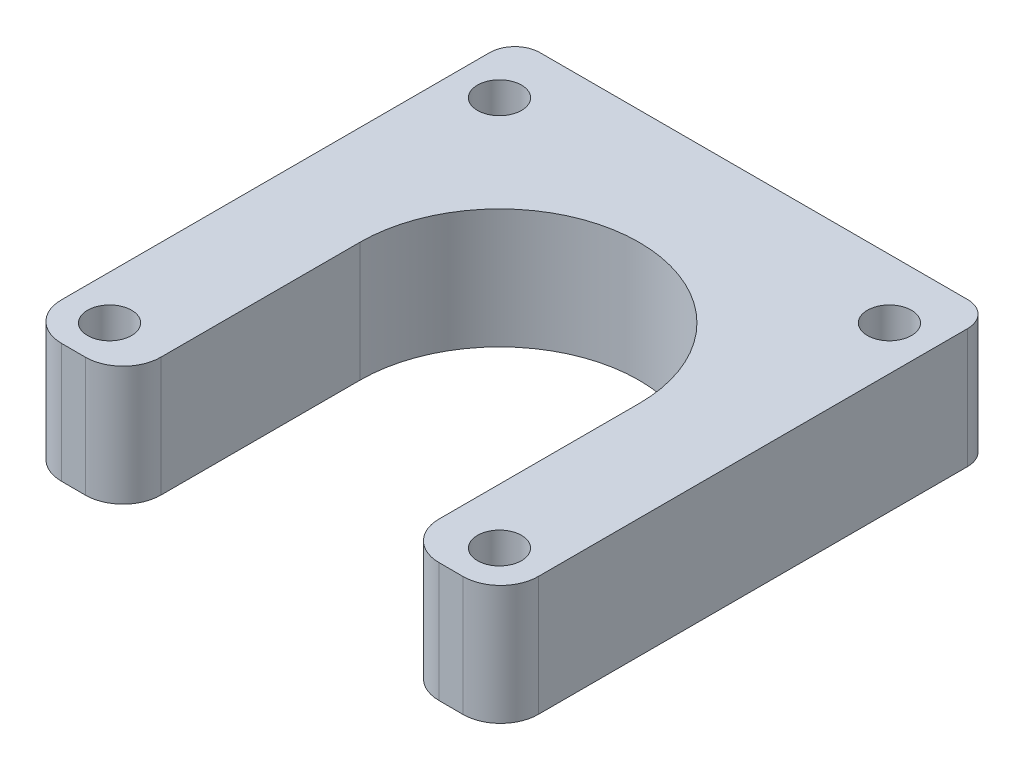
ISO-10303-21;
HEADER;
FILE_DESCRIPTION(('STEP AP214'),'2;1');
FILE_NAME('part.step','',(''),(''),'','','');
FILE_SCHEMA(('AUTOMOTIVE_DESIGN { 1 0 10303 214 1 1 1 1 }'));
ENDSEC;
DATA;
#1=APPLICATION_CONTEXT('core data for automotive mechanical design processes');
#2=APPLICATION_PROTOCOL_DEFINITION('international standard','automotive_design',2000,#1);
#3=PRODUCT_CONTEXT('',#1,'mechanical');
#4=PRODUCT('Part','Part','',(#3));
#5=PRODUCT_RELATED_PRODUCT_CATEGORY('part','',(#4));
#6=PRODUCT_DEFINITION_FORMATION('','',#4);
#7=PRODUCT_DEFINITION_CONTEXT('part definition',#1,'design');
#8=PRODUCT_DEFINITION('design','',#6,#7);
#9=PRODUCT_DEFINITION_SHAPE('','',#8);
#10=(LENGTH_UNIT() NAMED_UNIT(*) SI_UNIT(.MILLI.,.METRE.));
#11=(NAMED_UNIT(*) PLANE_ANGLE_UNIT() SI_UNIT($,.RADIAN.));
#12=(NAMED_UNIT(*) SI_UNIT($,.STERADIAN.) SOLID_ANGLE_UNIT());
#13=UNCERTAINTY_MEASURE_WITH_UNIT(LENGTH_MEASURE(1.E-05),#10,'distance_accuracy_value','');
#14=(GEOMETRIC_REPRESENTATION_CONTEXT(3) GLOBAL_UNCERTAINTY_ASSIGNED_CONTEXT((#13)) GLOBAL_UNIT_ASSIGNED_CONTEXT((#10,
#11,#12)) REPRESENTATION_CONTEXT('',''));
#15=CARTESIAN_POINT('',(0.,0.,0.));
#16=DIRECTION('',(0.,0.,1.));
#17=DIRECTION('',(1.,0.,0.));
#18=AXIS2_PLACEMENT_3D('',#15,#16,#17);
#19=CARTESIAN_POINT('',(13.4999920055001,9.5,10.6274478684913));
#20=DIRECTION('',(0.,1.,0.));
#21=DIRECTION('',(0.,0.,1.));
#22=AXIS2_PLACEMENT_3D('',#19,#20,#21);
#23=PLANE('',#22);
#24=CARTESIAN_POINT('',(13.0000039955001,9.5,10.216258));
#25=DIRECTION('',(0.,1.,0.));
#26=DIRECTION('',(0.,0.,1.));
#27=AXIS2_PLACEMENT_3D('',#24,#25,#26);
#28=CIRCLE('',#27,1.75);
#29=CARTESIAN_POINT('',(13.0000039955001,9.5,11.966258));
#30=VERTEX_POINT('',#29);
#31=EDGE_CURVE('E317',#30,#30,#28,.T.);
#32=ORIENTED_EDGE('',*,*,#31,.F.);
#33=EDGE_LOOP('',(#32));
#34=FACE_BOUND('',#33,.T.);
#35=CARTESIAN_POINT('',(-17.9999960045,9.5,10.216258));
#36=DIRECTION('',(0.,1.,0.));
#37=DIRECTION('',(0.,0.,1.));
#38=AXIS2_PLACEMENT_3D('',#35,#36,#37);
#39=CIRCLE('',#38,1.75);
#40=CARTESIAN_POINT('',(-17.9999960045,9.5,11.966258));
#41=VERTEX_POINT('',#40);
#42=EDGE_CURVE('E170',#41,#41,#39,.T.);
#43=ORIENTED_EDGE('',*,*,#42,.F.);
#44=EDGE_LOOP('',(#43));
#45=FACE_BOUND('',#44,.T.);
#46=CARTESIAN_POINT('',(13.4999920055001,9.5,10.6274478684913));
#47=DIRECTION('',(0.,1.,0.));
#48=DIRECTION('',(0.,0.,1.));
#49=AXIS2_PLACEMENT_3D('',#46,#47,#48);
#50=CIRCLE('',#49,3.);
#51=CARTESIAN_POINT('',(13.4911512782193,9.5,13.6274348420532));
#52=VERTEX_POINT('',#51);
#53=CARTESIAN_POINT('',(16.4999920055001,9.5,10.6274478684913));
#54=VERTEX_POINT('',#53);
#55=EDGE_CURVE('E193',#52,#54,#50,.T.);
#56=ORIENTED_EDGE('',*,*,#55,.T.);
#57=DIRECTION('',(0.,0.,-1.));
#58=VECTOR('',#57,1.);
#59=CARTESIAN_POINT('',(16.4999920055001,9.5,9.99405524209995));
#60=LINE('',#59,#58);
#61=CARTESIAN_POINT('',(16.4999925005001,9.5,-23.500009));
#62=VERTEX_POINT('',#61);
#63=EDGE_CURVE('E111',#54,#62,#60,.T.);
#64=ORIENTED_EDGE('',*,*,#63,.T.);
#65=CARTESIAN_POINT('',(14.4999900255,9.5,-23.500009));
#66=DIRECTION('',(0.,1.,0.));
#67=DIRECTION('',(0.,0.,1.));
#68=AXIS2_PLACEMENT_3D('',#65,#66,#67);
#69=CIRCLE('',#68,2.00000247500008);
#70=CARTESIAN_POINT('',(14.4999900255,9.5,-25.5000109800001));
#71=VERTEX_POINT('',#70);
#72=EDGE_CURVE('E226',#62,#71,#69,.T.);
#73=ORIENTED_EDGE('',*,*,#72,.T.);
#74=DIRECTION('',(-1.,0.,0.));
#75=VECTOR('',#74,1.);
#76=CARTESIAN_POINT('',(14.4999900255,9.5,-25.5000109800001));
#77=LINE('',#76,#75);
#78=CARTESIAN_POINT('',(-19.4999939745,9.5,-25.5000109800001));
#79=VERTEX_POINT('',#78);
#80=EDGE_CURVE('E245',#71,#79,#77,.T.);
#81=ORIENTED_EDGE('',*,*,#80,.T.);
#82=CARTESIAN_POINT('',(-19.4999910045007,9.5,-23.5000109800021));
#83=DIRECTION('',(0.,1.,0.));
#84=DIRECTION('',(0.,0.,1.));
#85=AXIS2_PLACEMENT_3D('',#82,#83,#84);
#86=CIRCLE('',#85,2.00000000000012);
#87=CARTESIAN_POINT('',(-21.4999910044999,9.5,-23.5000090698));
#88=VERTEX_POINT('',#87);
#89=EDGE_CURVE('E242',#79,#88,#86,.T.);
#90=ORIENTED_EDGE('',*,*,#89,.T.);
#91=DIRECTION('',(-2.67661864643519E-08,0.,1.));
#92=VECTOR('',#91,1.);
#93=CARTESIAN_POINT('',(-21.4999910044999,9.5,-23.5000090698));
#94=LINE('',#93,#92);
#95=CARTESIAN_POINT('',(-21.4999919154377,9.5,10.5331463351113));
#96=VERTEX_POINT('',#95);
#97=EDGE_CURVE('E244',#88,#96,#94,.T.);
#98=ORIENTED_EDGE('',*,*,#97,.T.);
#99=CARTESIAN_POINT('',(-18.4999919154377,9.5,10.5331464154099));
#100=DIRECTION('',(0.,1.,0.));
#101=DIRECTION('',(0.,0.,-1.));
#102=AXIS2_PLACEMENT_3D('',#99,#100,#101);
#103=CIRCLE('',#102,3.);
#104=CARTESIAN_POINT('',(-18.5088326427184,9.5,13.5331333889718));
#105=VERTEX_POINT('',#104);
#106=EDGE_CURVE('E247',#96,#105,#103,.T.);
#107=ORIENTED_EDGE('',*,*,#106,.T.);
#108=DIRECTION('',(0.99999565785397,0.,0.00294690909357009));
#109=VECTOR('',#108,1.);
#110=CARTESIAN_POINT('',(-18.5088326427184,9.5,13.5331333889718));
#111=LINE('',#110,#109);
#112=CARTESIAN_POINT('',(-16.6088367317806,9.5,13.5387325285118));
#113=VERTEX_POINT('',#112);
#114=EDGE_CURVE('E253',#105,#113,#111,.T.);
#115=ORIENTED_EDGE('',*,*,#114,.T.);
#116=CARTESIAN_POINT('',(-16.5999960044998,9.5,10.5387455549499));
#117=DIRECTION('',(0.,1.,0.));
#118=DIRECTION('',(0.,0.,1.));
#119=AXIS2_PLACEMENT_3D('',#116,#117,#118);
#120=CIRCLE('',#119,3.);
#121=CARTESIAN_POINT('',(-13.5999960044998,9.5,10.5387455549499));
#122=VERTEX_POINT('',#121);
#123=EDGE_CURVE('E255',#113,#122,#120,.T.);
#124=ORIENTED_EDGE('',*,*,#123,.T.);
#125=DIRECTION('',(0.,0.,-1.));
#126=VECTOR('',#125,1.);
#127=CARTESIAN_POINT('',(-13.5999960044998,9.5,-5.28374200000004));
#128=LINE('',#127,#126);
#129=CARTESIAN_POINT('',(-13.5999960044998,9.5,-5.28374200000004));
#130=VERTEX_POINT('',#129);
#131=EDGE_CURVE('E257',#122,#130,#128,.T.);
#132=ORIENTED_EDGE('',*,*,#131,.T.);
#133=CARTESIAN_POINT('',(-2.49999600449996,9.5,-5.28374200000004));
#134=DIRECTION('',(0.,-1.,0.));
#135=DIRECTION('',(0.,0.,1.));
#136=AXIS2_PLACEMENT_3D('',#133,#134,#135);
#137=CIRCLE('',#136,11.0999999999999);
#138=CARTESIAN_POINT('',(8.60000399549993,9.5,-5.28374200000004));
#139=VERTEX_POINT('',#138);
#140=EDGE_CURVE('E148',#130,#139,#137,.T.);
#141=ORIENTED_EDGE('',*,*,#140,.T.);
#142=DIRECTION('',(0.,0.,1.));
#143=VECTOR('',#142,1.);
#144=CARTESIAN_POINT('',(8.60000399549993,9.5,-5.28374200000004));
#145=LINE('',#144,#143);
#146=CARTESIAN_POINT('',(8.60000399549993,9.5,10.6218487522347));
#147=VERTEX_POINT('',#146);
#148=EDGE_CURVE('E142',#139,#147,#145,.T.);
#149=ORIENTED_EDGE('',*,*,#148,.T.);
#150=CARTESIAN_POINT('',(11.6000039954999,9.5,10.6218487522348));
#151=DIRECTION('',(0.,1.,0.));
#152=DIRECTION('',(0.,0.,-1.));
#153=AXIS2_PLACEMENT_3D('',#150,#151,#152);
#154=CIRCLE('',#153,3.);
#155=CARTESIAN_POINT('',(11.5911632682192,9.5,13.6218357257967));
#156=VERTEX_POINT('',#155);
#157=EDGE_CURVE('E146',#147,#156,#154,.T.);
#158=ORIENTED_EDGE('',*,*,#157,.T.);
#159=DIRECTION('',(0.99999565785397,0.,0.00294690909357004));
#160=VECTOR('',#159,1.);
#161=CARTESIAN_POINT('',(11.5911632682192,9.5,13.6218357257967));
#162=LINE('',#161,#160);
#163=EDGE_CURVE('E50',#156,#52,#162,.T.);
#164=ORIENTED_EDGE('',*,*,#163,.T.);
#165=EDGE_LOOP('',(#56,#64,#73,#81,#90,#98,#107,#115,#124,#132,#141,#149,#158,#164));
#166=FACE_BOUND('',#165,.T.);
#167=CARTESIAN_POINT('',(-17.9999960045,9.5,-20.783742));
#168=DIRECTION('',(0.,1.,0.));
#169=DIRECTION('',(0.,0.,1.));
#170=AXIS2_PLACEMENT_3D('',#167,#168,#169);
#171=CIRCLE('',#170,1.75);
#172=CARTESIAN_POINT('',(-17.9999960045,9.5,-19.033742));
#173=VERTEX_POINT('',#172);
#174=EDGE_CURVE('E323',#173,#173,#171,.T.);
#175=ORIENTED_EDGE('',*,*,#174,.F.);
#176=EDGE_LOOP('',(#175));
#177=FACE_BOUND('',#176,.T.);
#178=CARTESIAN_POINT('',(13.0000039955001,9.5,-20.783742));
#179=DIRECTION('',(0.,1.,0.));
#180=DIRECTION('',(0.,0.,1.));
#181=AXIS2_PLACEMENT_3D('',#178,#179,#180);
#182=CIRCLE('',#181,1.75);
#183=CARTESIAN_POINT('',(13.0000039955001,9.5,-19.033742));
#184=VERTEX_POINT('',#183);
#185=EDGE_CURVE('E308',#184,#184,#182,.T.);
#186=ORIENTED_EDGE('',*,*,#185,.F.);
#187=EDGE_LOOP('',(#186));
#188=FACE_BOUND('',#187,.T.);
#189=ADVANCED_FACE('F33',(#34,#45,#166,#177,#188),#23,.T.);
#190=CARTESIAN_POINT('',(13.4999920055001,0.,10.6274478684913));
#191=DIRECTION('',(0.,1.,0.));
#192=DIRECTION('',(0.,0.,1.));
#193=AXIS2_PLACEMENT_3D('',#190,#191,#192);
#194=PLANE('',#193);
#195=CARTESIAN_POINT('',(13.4999920055001,0.,10.6274478684913));
#196=DIRECTION('',(0.,1.,0.));
#197=DIRECTION('',(0.,0.,1.));
#198=AXIS2_PLACEMENT_3D('',#195,#196,#197);
#199=CIRCLE('',#198,3.);
#200=CARTESIAN_POINT('',(13.4911512782193,0.,13.6274348420532));
#201=VERTEX_POINT('',#200);
#202=CARTESIAN_POINT('',(16.4999920055001,0.,10.6274478684913));
#203=VERTEX_POINT('',#202);
#204=EDGE_CURVE('E166',#201,#203,#199,.T.);
#205=ORIENTED_EDGE('',*,*,#204,.F.);
#206=DIRECTION('',(0.99999565785397,0.,0.00294690909357004));
#207=VECTOR('',#206,1.);
#208=CARTESIAN_POINT('',(11.5911632682192,0.,13.6218357257967));
#209=LINE('',#208,#207);
#210=CARTESIAN_POINT('',(11.5911632682192,0.,13.6218357257967));
#211=VERTEX_POINT('',#210);
#212=EDGE_CURVE('E103',#211,#201,#209,.T.);
#213=ORIENTED_EDGE('',*,*,#212,.F.);
#214=CARTESIAN_POINT('',(11.6000039954999,0.,10.6218487522348));
#215=DIRECTION('',(0.,1.,0.));
#216=DIRECTION('',(0.,0.,-1.));
#217=AXIS2_PLACEMENT_3D('',#214,#215,#216);
#218=CIRCLE('',#217,3.);
#219=CARTESIAN_POINT('',(8.60000399549993,0.,10.6218487522347));
#220=VERTEX_POINT('',#219);
#221=EDGE_CURVE('E97',#220,#211,#218,.T.);
#222=ORIENTED_EDGE('',*,*,#221,.F.);
#223=DIRECTION('',(0.,0.,1.));
#224=VECTOR('',#223,1.);
#225=CARTESIAN_POINT('',(8.60000399549993,0.,-5.28374200000004));
#226=LINE('',#225,#224);
#227=CARTESIAN_POINT('',(8.60000399549993,0.,-5.28374200000004));
#228=VERTEX_POINT('',#227);
#229=EDGE_CURVE('E156',#228,#220,#226,.T.);
#230=ORIENTED_EDGE('',*,*,#229,.F.);
#231=CARTESIAN_POINT('',(-2.49999600449996,0.,-5.28374200000004));
#232=DIRECTION('',(0.,-1.,0.));
#233=DIRECTION('',(0.,0.,1.));
#234=AXIS2_PLACEMENT_3D('',#231,#232,#233);
#235=CIRCLE('',#234,11.0999999999999);
#236=CARTESIAN_POINT('',(-13.5999960044998,0.,-5.28374200000004));
#237=VERTEX_POINT('',#236);
#238=EDGE_CURVE('E188',#237,#228,#235,.T.);
#239=ORIENTED_EDGE('',*,*,#238,.F.);
#240=DIRECTION('',(0.,0.,-1.));
#241=VECTOR('',#240,1.);
#242=CARTESIAN_POINT('',(-13.5999960044998,0.,-5.28374200000004));
#243=LINE('',#242,#241);
#244=CARTESIAN_POINT('',(-13.5999960044998,0.,10.5387455549499));
#245=VERTEX_POINT('',#244);
#246=EDGE_CURVE('E186',#245,#237,#243,.T.);
#247=ORIENTED_EDGE('',*,*,#246,.F.);
#248=CARTESIAN_POINT('',(-16.5999960044998,0.,10.5387455549499));
#249=DIRECTION('',(0.,1.,0.));
#250=DIRECTION('',(0.,0.,1.));
#251=AXIS2_PLACEMENT_3D('',#248,#249,#250);
#252=CIRCLE('',#251,3.);
#253=CARTESIAN_POINT('',(-16.6088367317806,0.,13.5387325285118));
#254=VERTEX_POINT('',#253);
#255=EDGE_CURVE('E184',#254,#245,#252,.T.);
#256=ORIENTED_EDGE('',*,*,#255,.F.);
#257=DIRECTION('',(0.99999565785397,0.,0.00294690909357009));
#258=VECTOR('',#257,1.);
#259=CARTESIAN_POINT('',(-18.5088326427184,0.,13.5331333889718));
#260=LINE('',#259,#258);
#261=CARTESIAN_POINT('',(-18.5088326427184,0.,13.5331333889718));
#262=VERTEX_POINT('',#261);
#263=EDGE_CURVE('E182',#262,#254,#260,.T.);
#264=ORIENTED_EDGE('',*,*,#263,.F.);
#265=CARTESIAN_POINT('',(-18.4999919154377,0.,10.5331464154099));
#266=DIRECTION('',(0.,1.,0.));
#267=DIRECTION('',(0.,0.,-1.));
#268=AXIS2_PLACEMENT_3D('',#265,#266,#267);
#269=CIRCLE('',#268,3.);
#270=CARTESIAN_POINT('',(-21.4999919154377,0.,10.5331463351113));
#271=VERTEX_POINT('',#270);
#272=EDGE_CURVE('E180',#271,#262,#269,.T.);
#273=ORIENTED_EDGE('',*,*,#272,.F.);
#274=DIRECTION('',(-2.67661864643519E-08,0.,1.));
#275=VECTOR('',#274,1.);
#276=CARTESIAN_POINT('',(-21.4999910044999,0.,-23.5000090698));
#277=LINE('',#276,#275);
#278=CARTESIAN_POINT('',(-21.4999910044999,0.,-23.5000090698));
#279=VERTEX_POINT('',#278);
#280=EDGE_CURVE('E178',#279,#271,#277,.T.);
#281=ORIENTED_EDGE('',*,*,#280,.F.);
#282=CARTESIAN_POINT('',(-19.4999910045007,0.,-23.5000109800021));
#283=DIRECTION('',(0.,1.,0.));
#284=DIRECTION('',(0.,0.,1.));
#285=AXIS2_PLACEMENT_3D('',#282,#283,#284);
#286=CIRCLE('',#285,2.00000000000012);
#287=CARTESIAN_POINT('',(-19.4999939745,0.,-25.5000109800001));
#288=VERTEX_POINT('',#287);
#289=EDGE_CURVE('E176',#288,#279,#286,.T.);
#290=ORIENTED_EDGE('',*,*,#289,.F.);
#291=DIRECTION('',(-1.,0.,0.));
#292=VECTOR('',#291,1.);
#293=CARTESIAN_POINT('',(14.4999900255,0.,-25.5000109800001));
#294=LINE('',#293,#292);
#295=CARTESIAN_POINT('',(14.4999900255,0.,-25.5000109800001));
#296=VERTEX_POINT('',#295);
#297=EDGE_CURVE('E174',#296,#288,#294,.T.);
#298=ORIENTED_EDGE('',*,*,#297,.F.);
#299=CARTESIAN_POINT('',(14.4999900255,0.,-23.500009));
#300=DIRECTION('',(0.,1.,0.));
#301=DIRECTION('',(0.,0.,1.));
#302=AXIS2_PLACEMENT_3D('',#299,#300,#301);
#303=CIRCLE('',#302,2.00000247500008);
#304=CARTESIAN_POINT('',(16.4999925005001,0.,-23.500009));
#305=VERTEX_POINT('',#304);
#306=EDGE_CURVE('E172',#305,#296,#303,.T.);
#307=ORIENTED_EDGE('',*,*,#306,.F.);
#308=DIRECTION('',(3.14398680294202E-08,0.,-0.999999999999999));
#309=VECTOR('',#308,1.);
#310=CARTESIAN_POINT('',(16.4999920055001,0.,7.98867363299999));
#311=LINE('',#310,#309);
#312=EDGE_CURVE('E169',#203,#305,#311,.T.);
#313=ORIENTED_EDGE('',*,*,#312,.F.);
#314=EDGE_LOOP('',(#205,#213,#222,#230,#239,#247,#256,#264,#273,#281,#290,#298,#307,#313));
#315=FACE_BOUND('',#314,.T.);
#316=CARTESIAN_POINT('',(-17.9999960045,0.,10.216258));
#317=DIRECTION('',(0.,1.,0.));
#318=DIRECTION('',(0.,0.,1.));
#319=AXIS2_PLACEMENT_3D('',#316,#317,#318);
#320=CIRCLE('',#319,1.75);
#321=CARTESIAN_POINT('',(-17.9999960045,0.,11.966258));
#322=VERTEX_POINT('',#321);
#323=EDGE_CURVE('E326',#322,#322,#320,.T.);
#324=ORIENTED_EDGE('',*,*,#323,.T.);
#325=EDGE_LOOP('',(#324));
#326=FACE_BOUND('',#325,.T.);
#327=CARTESIAN_POINT('',(-17.9999960045,0.,-20.783742));
#328=DIRECTION('',(0.,1.,0.));
#329=DIRECTION('',(0.,0.,1.));
#330=AXIS2_PLACEMENT_3D('',#327,#328,#329);
#331=CIRCLE('',#330,1.75);
#332=CARTESIAN_POINT('',(-17.9999960045,0.,-19.033742));
#333=VERTEX_POINT('',#332);
#334=EDGE_CURVE('E320',#333,#333,#331,.T.);
#335=ORIENTED_EDGE('',*,*,#334,.T.);
#336=EDGE_LOOP('',(#335));
#337=FACE_BOUND('',#336,.T.);
#338=CARTESIAN_POINT('',(13.0000039955001,0.,10.216258));
#339=DIRECTION('',(0.,1.,0.));
#340=DIRECTION('',(0.,0.,1.));
#341=AXIS2_PLACEMENT_3D('',#338,#339,#340);
#342=CIRCLE('',#341,1.75);
#343=CARTESIAN_POINT('',(13.0000039955001,0.,11.966258));
#344=VERTEX_POINT('',#343);
#345=EDGE_CURVE('E314',#344,#344,#342,.T.);
#346=ORIENTED_EDGE('',*,*,#345,.T.);
#347=EDGE_LOOP('',(#346));
#348=FACE_BOUND('',#347,.T.);
#349=CARTESIAN_POINT('',(13.0000039955001,0.,-20.783742));
#350=DIRECTION('',(0.,1.,0.));
#351=DIRECTION('',(0.,0.,1.));
#352=AXIS2_PLACEMENT_3D('',#349,#350,#351);
#353=CIRCLE('',#352,1.75);
#354=CARTESIAN_POINT('',(13.0000039955001,0.,-19.033742));
#355=VERTEX_POINT('',#354);
#356=EDGE_CURVE('E311',#355,#355,#353,.T.);
#357=ORIENTED_EDGE('',*,*,#356,.T.);
#358=EDGE_LOOP('',(#357));
#359=FACE_BOUND('',#358,.T.);
#360=ADVANCED_FACE('F230',(#315,#326,#337,#348,#359),#194,.F.);
#361=CARTESIAN_POINT('',(13.4999920055001,9.5,10.6274478684913));
#362=DIRECTION('',(0.,-1.,0.));
#363=DIRECTION('',(0.,0.,-1.));
#364=AXIS2_PLACEMENT_3D('',#361,#362,#363);
#365=CYLINDRICAL_SURFACE('',#364,3.);
#366=ORIENTED_EDGE('',*,*,#204,.T.);
#367=DIRECTION('',(0.,-1.,0.));
#368=VECTOR('',#367,1.);
#369=CARTESIAN_POINT('',(16.4999920055001,9.5,10.6274478684913));
#370=LINE('',#369,#368);
#371=EDGE_CURVE('E11',#54,#203,#370,.T.);
#372=ORIENTED_EDGE('',*,*,#371,.F.);
#373=ORIENTED_EDGE('',*,*,#55,.F.);
#374=DIRECTION('',(0.,-1.,0.));
#375=VECTOR('',#374,1.);
#376=CARTESIAN_POINT('',(13.4911512782193,9.5,13.6274348420532));
#377=LINE('',#376,#375);
#378=EDGE_CURVE('E162',#52,#201,#377,.T.);
#379=ORIENTED_EDGE('',*,*,#378,.T.);
#380=EDGE_LOOP('',(#366,#372,#373,#379));
#381=FACE_BOUND('',#380,.T.);
#382=ADVANCED_FACE('F35',(#381),#365,.T.);
#383=CARTESIAN_POINT('',(16.4999920055001,9.5,7.98867363299999));
#384=DIRECTION('',(-0.999999999999999,0.,-3.14398680294202E-08));
#385=DIRECTION('',(-3.14398680294202E-08,0.,1.));
#386=AXIS2_PLACEMENT_3D('',#383,#384,#385);
#387=PLANE('',#386);
#388=ORIENTED_EDGE('',*,*,#312,.T.);
#389=DIRECTION('',(0.,-1.,0.));
#390=VECTOR('',#389,1.);
#391=CARTESIAN_POINT('',(16.4999925005001,9.5,-23.500009));
#392=LINE('',#391,#390);
#393=EDGE_CURVE('E42',#62,#305,#392,.T.);
#394=ORIENTED_EDGE('',*,*,#393,.F.);
#395=ORIENTED_EDGE('',*,*,#63,.F.);
#396=ORIENTED_EDGE('',*,*,#371,.T.);
#397=EDGE_LOOP('',(#388,#394,#395,#396));
#398=FACE_BOUND('',#397,.T.);
#399=ADVANCED_FACE('F456',(#398),#387,.F.);
#400=CARTESIAN_POINT('',(14.4999900255,9.5,-23.500009));
#401=DIRECTION('',(0.,-1.,0.));
#402=DIRECTION('',(0.,0.,-1.));
#403=AXIS2_PLACEMENT_3D('',#400,#401,#402);
#404=CYLINDRICAL_SURFACE('',#403,2.00000247500008);
#405=ORIENTED_EDGE('',*,*,#306,.T.);
#406=DIRECTION('',(0.,-1.,0.));
#407=VECTOR('',#406,1.);
#408=CARTESIAN_POINT('',(14.4999900255,9.5,-25.5000109800001));
#409=LINE('',#408,#407);
#410=EDGE_CURVE('E218',#71,#296,#409,.T.);
#411=ORIENTED_EDGE('',*,*,#410,.F.);
#412=ORIENTED_EDGE('',*,*,#72,.F.);
#413=ORIENTED_EDGE('',*,*,#393,.T.);
#414=EDGE_LOOP('',(#405,#411,#412,#413));
#415=FACE_BOUND('',#414,.T.);
#416=ADVANCED_FACE('F224',(#415),#404,.T.);
#417=CARTESIAN_POINT('',(14.4999900255,9.5,-25.5000109800001));
#418=DIRECTION('',(0.,0.,1.));
#419=DIRECTION('',(1.,0.,0.));
#420=AXIS2_PLACEMENT_3D('',#417,#418,#419);
#421=PLANE('',#420);
#422=ORIENTED_EDGE('',*,*,#297,.T.);
#423=DIRECTION('',(0.,-1.,0.));
#424=VECTOR('',#423,1.);
#425=CARTESIAN_POINT('',(-19.4999939745,9.5,-25.5000109800001));
#426=LINE('',#425,#424);
#427=EDGE_CURVE('E215',#79,#288,#426,.T.);
#428=ORIENTED_EDGE('',*,*,#427,.F.);
#429=ORIENTED_EDGE('',*,*,#80,.F.);
#430=ORIENTED_EDGE('',*,*,#410,.T.);
#431=EDGE_LOOP('',(#422,#428,#429,#430));
#432=FACE_BOUND('',#431,.T.);
#433=ADVANCED_FACE('F236',(#432),#421,.F.);
#434=CARTESIAN_POINT('',(-19.4999910045007,9.5,-23.5000109800021));
#435=DIRECTION('',(0.,-1.,0.));
#436=DIRECTION('',(0.,0.,-1.));
#437=AXIS2_PLACEMENT_3D('',#434,#435,#436);
#438=CYLINDRICAL_SURFACE('',#437,2.00000000000012);
#439=ORIENTED_EDGE('',*,*,#289,.T.);
#440=DIRECTION('',(0.,-1.,0.));
#441=VECTOR('',#440,1.);
#442=CARTESIAN_POINT('',(-21.4999910044999,9.5,-23.5000090698));
#443=LINE('',#442,#441);
#444=EDGE_CURVE('E212',#88,#279,#443,.T.);
#445=ORIENTED_EDGE('',*,*,#444,.F.);
#446=ORIENTED_EDGE('',*,*,#89,.F.);
#447=ORIENTED_EDGE('',*,*,#427,.T.);
#448=EDGE_LOOP('',(#439,#445,#446,#447));
#449=FACE_BOUND('',#448,.T.);
#450=ADVANCED_FACE('F240',(#449),#438,.T.);
#451=CARTESIAN_POINT('',(-21.4999910044999,9.5,-23.5000090698));
#452=DIRECTION('',(1.,0.,2.67661864643519E-08));
#453=DIRECTION('',(2.67661864643519E-08,0.,-1.));
#454=AXIS2_PLACEMENT_3D('',#451,#452,#453);
#455=PLANE('',#454);
#456=ORIENTED_EDGE('',*,*,#280,.T.);
#457=DIRECTION('',(0.,-1.,0.));
#458=VECTOR('',#457,1.);
#459=CARTESIAN_POINT('',(-21.4999919154377,9.5,10.5331463351113));
#460=LINE('',#459,#458);
#461=EDGE_CURVE('E209',#96,#271,#460,.T.);
#462=ORIENTED_EDGE('',*,*,#461,.F.);
#463=ORIENTED_EDGE('',*,*,#97,.F.);
#464=ORIENTED_EDGE('',*,*,#444,.T.);
#465=EDGE_LOOP('',(#456,#462,#463,#464));
#466=FACE_BOUND('',#465,.T.);
#467=ADVANCED_FACE('F421',(#466),#455,.F.);
#468=CARTESIAN_POINT('',(-18.4999919154377,9.5,10.5331464154099));
#469=DIRECTION('',(0.,-1.,0.));
#470=DIRECTION('',(0.,0.,-1.));
#471=AXIS2_PLACEMENT_3D('',#468,#469,#470);
#472=CYLINDRICAL_SURFACE('',#471,3.);
#473=ORIENTED_EDGE('',*,*,#272,.T.);
#474=DIRECTION('',(0.,-1.,0.));
#475=VECTOR('',#474,1.);
#476=CARTESIAN_POINT('',(-18.5088326427184,9.5,13.5331333889718));
#477=LINE('',#476,#475);
#478=EDGE_CURVE('E206',#105,#262,#477,.T.);
#479=ORIENTED_EDGE('',*,*,#478,.F.);
#480=ORIENTED_EDGE('',*,*,#106,.F.);
#481=ORIENTED_EDGE('',*,*,#461,.T.);
#482=EDGE_LOOP('',(#473,#479,#480,#481));
#483=FACE_BOUND('',#482,.T.);
#484=ADVANCED_FACE('F411',(#483),#472,.T.);
#485=CARTESIAN_POINT('',(-18.5088326427184,9.5,13.5331333889718));
#486=DIRECTION('',(0.00294690909357009,0.,-0.99999565785397));
#487=DIRECTION('',(-0.99999565785397,0.,-0.00294690909357009));
#488=AXIS2_PLACEMENT_3D('',#485,#486,#487);
#489=PLANE('',#488);
#490=ORIENTED_EDGE('',*,*,#263,.T.);
#491=DIRECTION('',(0.,-1.,0.));
#492=VECTOR('',#491,1.);
#493=CARTESIAN_POINT('',(-16.6088367317806,9.5,13.5387325285118));
#494=LINE('',#493,#492);
#495=EDGE_CURVE('E203',#113,#254,#494,.T.);
#496=ORIENTED_EDGE('',*,*,#495,.F.);
#497=ORIENTED_EDGE('',*,*,#114,.F.);
#498=ORIENTED_EDGE('',*,*,#478,.T.);
#499=EDGE_LOOP('',(#490,#496,#497,#498));
#500=FACE_BOUND('',#499,.T.);
#501=ADVANCED_FACE('F401',(#500),#489,.F.);
#502=CARTESIAN_POINT('',(-16.5999960044998,9.5,10.5387455549499));
#503=DIRECTION('',(0.,-1.,0.));
#504=DIRECTION('',(0.,0.,-1.));
#505=AXIS2_PLACEMENT_3D('',#502,#503,#504);
#506=CYLINDRICAL_SURFACE('',#505,3.);
#507=ORIENTED_EDGE('',*,*,#255,.T.);
#508=DIRECTION('',(0.,-1.,0.));
#509=VECTOR('',#508,1.);
#510=CARTESIAN_POINT('',(-13.5999960044998,9.5,10.5387455549499));
#511=LINE('',#510,#509);
#512=EDGE_CURVE('E200',#122,#245,#511,.T.);
#513=ORIENTED_EDGE('',*,*,#512,.F.);
#514=ORIENTED_EDGE('',*,*,#123,.F.);
#515=ORIENTED_EDGE('',*,*,#495,.T.);
#516=EDGE_LOOP('',(#507,#513,#514,#515));
#517=FACE_BOUND('',#516,.T.);
#518=ADVANCED_FACE('F392',(#517),#506,.T.);
#519=CARTESIAN_POINT('',(-13.5999960044998,9.5,-5.28374200000004));
#520=DIRECTION('',(-1.,0.,0.));
#521=DIRECTION('',(0.,0.,1.));
#522=AXIS2_PLACEMENT_3D('',#519,#520,#521);
#523=PLANE('',#522);
#524=ORIENTED_EDGE('',*,*,#246,.T.);
#525=DIRECTION('',(0.,-1.,0.));
#526=VECTOR('',#525,1.);
#527=CARTESIAN_POINT('',(-13.5999960044998,9.5,-5.28374200000004));
#528=LINE('',#527,#526);
#529=EDGE_CURVE('E197',#130,#237,#528,.T.);
#530=ORIENTED_EDGE('',*,*,#529,.F.);
#531=ORIENTED_EDGE('',*,*,#131,.F.);
#532=ORIENTED_EDGE('',*,*,#512,.T.);
#533=EDGE_LOOP('',(#524,#530,#531,#532));
#534=FACE_BOUND('',#533,.T.);
#535=ADVANCED_FACE('F263',(#534),#523,.F.);
#536=CARTESIAN_POINT('',(-2.49999600449996,9.5,-5.28374200000004));
#537=DIRECTION('',(0.,-1.,0.));
#538=DIRECTION('',(0.,0.,-1.));
#539=AXIS2_PLACEMENT_3D('',#536,#537,#538);
#540=CYLINDRICAL_SURFACE('',#539,11.0999999999999);
#541=ORIENTED_EDGE('',*,*,#238,.T.);
#542=DIRECTION('',(0.,-1.,0.));
#543=VECTOR('',#542,1.);
#544=CARTESIAN_POINT('',(8.60000399549993,9.5,-5.28374200000004));
#545=LINE('',#544,#543);
#546=EDGE_CURVE('E157',#139,#228,#545,.T.);
#547=ORIENTED_EDGE('',*,*,#546,.F.);
#548=ORIENTED_EDGE('',*,*,#140,.F.);
#549=ORIENTED_EDGE('',*,*,#529,.T.);
#550=EDGE_LOOP('',(#541,#547,#548,#549));
#551=FACE_BOUND('',#550,.T.);
#552=ADVANCED_FACE('F267',(#551),#540,.F.);
#553=CARTESIAN_POINT('',(8.60000399549993,9.5,-5.28374200000004));
#554=DIRECTION('',(1.,0.,0.));
#555=DIRECTION('',(0.,0.,-1.));
#556=AXIS2_PLACEMENT_3D('',#553,#554,#555);
#557=PLANE('',#556);
#558=ORIENTED_EDGE('',*,*,#229,.T.);
#559=DIRECTION('',(0.,-1.,0.));
#560=VECTOR('',#559,1.);
#561=CARTESIAN_POINT('',(8.60000399549993,9.5,10.6218487522347));
#562=LINE('',#561,#560);
#563=EDGE_CURVE('E153',#147,#220,#562,.T.);
#564=ORIENTED_EDGE('',*,*,#563,.F.);
#565=ORIENTED_EDGE('',*,*,#148,.F.);
#566=ORIENTED_EDGE('',*,*,#546,.T.);
#567=EDGE_LOOP('',(#558,#564,#565,#566));
#568=FACE_BOUND('',#567,.T.);
#569=ADVANCED_FACE('F154',(#568),#557,.F.);
#570=CARTESIAN_POINT('',(11.6000039954999,9.5,10.6218487522348));
#571=DIRECTION('',(0.,-1.,0.));
#572=DIRECTION('',(0.,0.,-1.));
#573=AXIS2_PLACEMENT_3D('',#570,#571,#572);
#574=CYLINDRICAL_SURFACE('',#573,3.);
#575=ORIENTED_EDGE('',*,*,#221,.T.);
#576=DIRECTION('',(0.,-1.,0.));
#577=VECTOR('',#576,1.);
#578=CARTESIAN_POINT('',(11.5911632682192,9.5,13.6218357257967));
#579=LINE('',#578,#577);
#580=EDGE_CURVE('E158',#156,#211,#579,.T.);
#581=ORIENTED_EDGE('',*,*,#580,.F.);
#582=ORIENTED_EDGE('',*,*,#157,.F.);
#583=ORIENTED_EDGE('',*,*,#563,.T.);
#584=EDGE_LOOP('',(#575,#581,#582,#583));
#585=FACE_BOUND('',#584,.T.);
#586=ADVANCED_FACE('F160',(#585),#574,.T.);
#587=CARTESIAN_POINT('',(11.5911632682192,9.5,13.6218357257967));
#588=DIRECTION('',(0.00294690909357004,0.,-0.99999565785397));
#589=DIRECTION('',(-0.99999565785397,0.,-0.00294690909357004));
#590=AXIS2_PLACEMENT_3D('',#587,#588,#589);
#591=PLANE('',#590);
#592=ORIENTED_EDGE('',*,*,#212,.T.);
#593=ORIENTED_EDGE('',*,*,#378,.F.);
#594=ORIENTED_EDGE('',*,*,#163,.F.);
#595=ORIENTED_EDGE('',*,*,#580,.T.);
#596=EDGE_LOOP('',(#592,#593,#594,#595));
#597=FACE_BOUND('',#596,.T.);
#598=ADVANCED_FACE('F271',(#597),#591,.F.);
#599=CARTESIAN_POINT('',(-17.9999960045,9.5,10.216258));
#600=DIRECTION('',(0.,-1.,0.));
#601=DIRECTION('',(0.,0.,-1.));
#602=AXIS2_PLACEMENT_3D('',#599,#600,#601);
#603=CYLINDRICAL_SURFACE('',#602,1.75);
#604=ORIENTED_EDGE('',*,*,#42,.T.);
#605=EDGE_LOOP('',(#604));
#606=FACE_BOUND('',#605,.T.);
#607=ORIENTED_EDGE('',*,*,#323,.F.);
#608=EDGE_LOOP('',(#607));
#609=FACE_BOUND('',#608,.T.);
#610=ADVANCED_FACE('F273',(#606,#609),#603,.F.);
#611=CARTESIAN_POINT('',(-17.9999960045,9.5,-20.783742));
#612=DIRECTION('',(0.,-1.,0.));
#613=DIRECTION('',(0.,0.,-1.));
#614=AXIS2_PLACEMENT_3D('',#611,#612,#613);
#615=CYLINDRICAL_SURFACE('',#614,1.75);
#616=ORIENTED_EDGE('',*,*,#174,.T.);
#617=EDGE_LOOP('',(#616));
#618=FACE_BOUND('',#617,.T.);
#619=ORIENTED_EDGE('',*,*,#334,.F.);
#620=EDGE_LOOP('',(#619));
#621=FACE_BOUND('',#620,.T.);
#622=ADVANCED_FACE('F279',(#618,#621),#615,.F.);
#623=CARTESIAN_POINT('',(13.0000039955001,9.5,10.216258));
#624=DIRECTION('',(0.,-1.,0.));
#625=DIRECTION('',(0.,0.,-1.));
#626=AXIS2_PLACEMENT_3D('',#623,#624,#625);
#627=CYLINDRICAL_SURFACE('',#626,1.75);
#628=ORIENTED_EDGE('',*,*,#31,.T.);
#629=EDGE_LOOP('',(#628));
#630=FACE_BOUND('',#629,.T.);
#631=ORIENTED_EDGE('',*,*,#345,.F.);
#632=EDGE_LOOP('',(#631));
#633=FACE_BOUND('',#632,.T.);
#634=ADVANCED_FACE('F295',(#630,#633),#627,.F.);
#635=CARTESIAN_POINT('',(13.0000039955001,9.5,-20.783742));
#636=DIRECTION('',(0.,-1.,0.));
#637=DIRECTION('',(0.,0.,-1.));
#638=AXIS2_PLACEMENT_3D('',#635,#636,#637);
#639=CYLINDRICAL_SURFACE('',#638,1.75);
#640=ORIENTED_EDGE('',*,*,#185,.T.);
#641=EDGE_LOOP('',(#640));
#642=FACE_BOUND('',#641,.T.);
#643=ORIENTED_EDGE('',*,*,#356,.F.);
#644=EDGE_LOOP('',(#643));
#645=FACE_BOUND('',#644,.T.);
#646=ADVANCED_FACE('F299',(#642,#645),#639,.F.);
#647=CLOSED_SHELL('',(#189,#360,#382,#399,#416,#433,#450,#467,#484,#501,#518,#535,#552,#569,
#586,#598,#610,#622,#634,#646));
#648=MANIFOLD_SOLID_BREP('B2',#647);
#649=ADVANCED_BREP_SHAPE_REPRESENTATION('',(#18,#648),#14);
#650=SHAPE_DEFINITION_REPRESENTATION(#9,#649);
ENDSEC;
END-ISO-10303-21;
